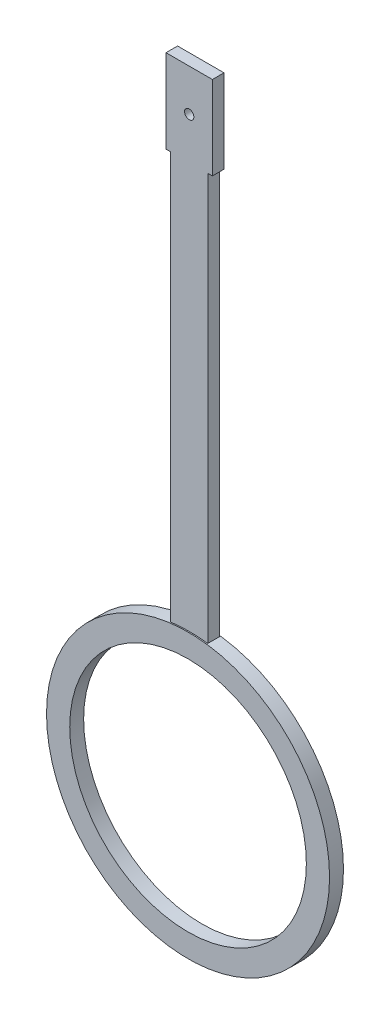
ISO-10303-21;
HEADER;
FILE_DESCRIPTION(('STEP AP214'),'2;1');
FILE_NAME('part.step','',(''),(''),'','','');
FILE_SCHEMA(('AUTOMOTIVE_DESIGN { 1 0 10303 214 1 1 1 1 }'));
ENDSEC;
DATA;
#1=APPLICATION_CONTEXT('core data for automotive mechanical design processes');
#2=APPLICATION_PROTOCOL_DEFINITION('international standard','automotive_design',2000,#1);
#3=PRODUCT_CONTEXT('',#1,'mechanical');
#4=PRODUCT('Part','Part','',(#3));
#5=PRODUCT_RELATED_PRODUCT_CATEGORY('part','',(#4));
#6=PRODUCT_DEFINITION_FORMATION('','',#4);
#7=PRODUCT_DEFINITION_CONTEXT('part definition',#1,'design');
#8=PRODUCT_DEFINITION('design','',#6,#7);
#9=PRODUCT_DEFINITION_SHAPE('','',#8);
#10=(LENGTH_UNIT() NAMED_UNIT(*) SI_UNIT(.MILLI.,.METRE.));
#11=(NAMED_UNIT(*) PLANE_ANGLE_UNIT() SI_UNIT($,.RADIAN.));
#12=(NAMED_UNIT(*) SI_UNIT($,.STERADIAN.) SOLID_ANGLE_UNIT());
#13=UNCERTAINTY_MEASURE_WITH_UNIT(LENGTH_MEASURE(1.E-05),#10,'distance_accuracy_value','');
#14=(GEOMETRIC_REPRESENTATION_CONTEXT(3) GLOBAL_UNCERTAINTY_ASSIGNED_CONTEXT((#13)) GLOBAL_UNIT_ASSIGNED_CONTEXT((#10,
#11,#12)) REPRESENTATION_CONTEXT('',''));
#15=CARTESIAN_POINT('',(0.,0.,0.));
#16=DIRECTION('',(0.,0.,1.));
#17=DIRECTION('',(1.,0.,0.));
#18=AXIS2_PLACEMENT_3D('',#15,#16,#17);
#19=CARTESIAN_POINT('',(0.,0.,1.5));
#20=DIRECTION('',(0.,0.,-1.));
#21=DIRECTION('',(-1.,0.,0.));
#22=AXIS2_PLACEMENT_3D('',#19,#20,#21);
#23=CYLINDRICAL_SURFACE('',#22,30.5);
#24=DIRECTION('',(0.,0.,-1.));
#25=VECTOR('',#24,1.);
#26=CARTESIAN_POINT('',(4.,30.2365672654817,1.5));
#27=LINE('',#26,#25);
#28=CARTESIAN_POINT('',(4.,30.2365672654817,1.25));
#29=VERTEX_POINT('',#28);
#30=CARTESIAN_POINT('',(4.,30.2365672654817,-1.25));
#31=VERTEX_POINT('',#30);
#32=EDGE_CURVE('E58',#29,#31,#27,.T.);
#33=ORIENTED_EDGE('',*,*,#32,.F.);
#34=CARTESIAN_POINT('',(0.,0.,1.25));
#35=DIRECTION('',(0.,0.,1.));
#36=DIRECTION('',(1.,0.,0.));
#37=AXIS2_PLACEMENT_3D('',#34,#35,#36);
#38=CIRCLE('',#37,30.5);
#39=CARTESIAN_POINT('',(-4.,30.2365672654817,1.25));
#40=VERTEX_POINT('',#39);
#41=EDGE_CURVE('E11',#29,#40,#38,.T.);
#42=ORIENTED_EDGE('',*,*,#41,.T.);
#43=DIRECTION('',(0.,0.,-1.));
#44=VECTOR('',#43,1.);
#45=CARTESIAN_POINT('',(-4.,30.2365672654817,1.5));
#46=LINE('',#45,#44);
#47=CARTESIAN_POINT('',(-4.,30.2365672654817,-1.25));
#48=VERTEX_POINT('',#47);
#49=EDGE_CURVE('E47',#48,#40,#46,.F.);
#50=ORIENTED_EDGE('',*,*,#49,.F.);
#51=CARTESIAN_POINT('',(0.,0.,-1.25));
#52=DIRECTION('',(0.,0.,1.));
#53=DIRECTION('',(1.,0.,0.));
#54=AXIS2_PLACEMENT_3D('',#51,#52,#53);
#55=CIRCLE('',#54,30.5);
#56=EDGE_CURVE('E152',#31,#48,#55,.T.);
#57=ORIENTED_EDGE('',*,*,#56,.F.);
#58=EDGE_LOOP('',(#33,#42,#50,#57));
#59=FACE_BOUND('',#58,.T.);
#60=CARTESIAN_POINT('',(0.,0.,1.5));
#61=DIRECTION('',(0.,0.,1.));
#62=DIRECTION('',(1.,0.,0.));
#63=AXIS2_PLACEMENT_3D('',#60,#61,#62);
#64=CIRCLE('',#63,30.5);
#65=CARTESIAN_POINT('',(30.5,0.,1.5));
#66=VERTEX_POINT('',#65);
#67=EDGE_CURVE('E151',#66,#66,#64,.T.);
#68=ORIENTED_EDGE('',*,*,#67,.F.);
#69=EDGE_LOOP('',(#68));
#70=FACE_BOUND('',#69,.T.);
#71=CARTESIAN_POINT('',(0.,0.,-1.5));
#72=DIRECTION('',(0.,0.,1.));
#73=DIRECTION('',(1.,0.,0.));
#74=AXIS2_PLACEMENT_3D('',#71,#72,#73);
#75=CIRCLE('',#74,30.5);
#76=CARTESIAN_POINT('',(30.5,0.,-1.5));
#77=VERTEX_POINT('',#76);
#78=EDGE_CURVE('E147',#77,#77,#75,.T.);
#79=ORIENTED_EDGE('',*,*,#78,.T.);
#80=EDGE_LOOP('',(#79));
#81=FACE_BOUND('',#80,.T.);
#82=ADVANCED_FACE('F41',(#59,#70,#81),#23,.T.);
#83=CARTESIAN_POINT('',(0.,0.,1.5));
#84=DIRECTION('',(0.,0.,1.));
#85=DIRECTION('',(1.,0.,0.));
#86=AXIS2_PLACEMENT_3D('',#83,#84,#85);
#87=PLANE('',#86);
#88=CARTESIAN_POINT('',(0.,0.,1.5));
#89=DIRECTION('',(0.,0.,1.));
#90=DIRECTION('',(1.,0.,0.));
#91=AXIS2_PLACEMENT_3D('',#88,#89,#90);
#92=CIRCLE('',#91,25.5);
#93=CARTESIAN_POINT('',(25.5,0.,1.5));
#94=VERTEX_POINT('',#93);
#95=EDGE_CURVE('E165',#94,#94,#92,.T.);
#96=ORIENTED_EDGE('',*,*,#95,.F.);
#97=EDGE_LOOP('',(#96));
#98=FACE_BOUND('',#97,.T.);
#99=ORIENTED_EDGE('',*,*,#67,.T.);
#100=EDGE_LOOP('',(#99));
#101=FACE_BOUND('',#100,.T.);
#102=ADVANCED_FACE('F217',(#98,#101),#87,.T.);
#103=CARTESIAN_POINT('',(0.,0.,-1.5));
#104=DIRECTION('',(0.,0.,1.));
#105=DIRECTION('',(1.,0.,0.));
#106=AXIS2_PLACEMENT_3D('',#103,#104,#105);
#107=PLANE('',#106);
#108=CARTESIAN_POINT('',(0.,0.,-1.5));
#109=DIRECTION('',(0.,0.,1.));
#110=DIRECTION('',(1.,0.,0.));
#111=AXIS2_PLACEMENT_3D('',#108,#109,#110);
#112=CIRCLE('',#111,25.5);
#113=CARTESIAN_POINT('',(25.5,0.,-1.5));
#114=VERTEX_POINT('',#113);
#115=EDGE_CURVE('E159',#114,#114,#112,.T.);
#116=ORIENTED_EDGE('',*,*,#115,.T.);
#117=EDGE_LOOP('',(#116));
#118=FACE_BOUND('',#117,.T.);
#119=ORIENTED_EDGE('',*,*,#78,.F.);
#120=EDGE_LOOP('',(#119));
#121=FACE_BOUND('',#120,.T.);
#122=ADVANCED_FACE('F224',(#118,#121),#107,.F.);
#123=CARTESIAN_POINT('',(-4.,118.,1.25));
#124=DIRECTION('',(1.,0.,0.));
#125=DIRECTION('',(0.,0.,-1.));
#126=AXIS2_PLACEMENT_3D('',#123,#124,#125);
#127=PLANE('',#126);
#128=DIRECTION('',(0.,-1.,0.));
#129=VECTOR('',#128,1.);
#130=CARTESIAN_POINT('',(-4.,118.,-1.25));
#131=LINE('',#130,#129);
#132=CARTESIAN_POINT('',(-4.,118.,-1.25));
#133=VERTEX_POINT('',#132);
#134=EDGE_CURVE('E128',#133,#48,#131,.T.);
#135=ORIENTED_EDGE('',*,*,#134,.T.);
#136=ORIENTED_EDGE('',*,*,#49,.T.);
#137=DIRECTION('',(0.,-1.,0.));
#138=VECTOR('',#137,1.);
#139=CARTESIAN_POINT('',(-4.,118.,1.25));
#140=LINE('',#139,#138);
#141=CARTESIAN_POINT('',(-4.,118.,1.25));
#142=VERTEX_POINT('',#141);
#143=EDGE_CURVE('E143',#142,#40,#140,.T.);
#144=ORIENTED_EDGE('',*,*,#143,.F.);
#145=DIRECTION('',(0.,0.,-1.));
#146=VECTOR('',#145,1.);
#147=CARTESIAN_POINT('',(-4.,118.,1.25));
#148=LINE('',#147,#146);
#149=EDGE_CURVE('E112',#142,#133,#148,.T.);
#150=ORIENTED_EDGE('',*,*,#149,.T.);
#151=EDGE_LOOP('',(#135,#136,#144,#150));
#152=FACE_BOUND('',#151,.T.);
#153=ADVANCED_FACE('F196',(#152),#127,.F.);
#154=CARTESIAN_POINT('',(4.,25.,1.25));
#155=DIRECTION('',(-1.,0.,0.));
#156=DIRECTION('',(0.,0.,1.));
#157=AXIS2_PLACEMENT_3D('',#154,#155,#156);
#158=PLANE('',#157);
#159=DIRECTION('',(0.,1.,0.));
#160=VECTOR('',#159,1.);
#161=CARTESIAN_POINT('',(4.,25.,1.25));
#162=LINE('',#161,#160);
#163=CARTESIAN_POINT('',(4.,118.,1.25));
#164=VERTEX_POINT('',#163);
#165=EDGE_CURVE('E141',#29,#164,#162,.T.);
#166=ORIENTED_EDGE('',*,*,#165,.F.);
#167=ORIENTED_EDGE('',*,*,#32,.T.);
#168=DIRECTION('',(0.,1.,0.));
#169=VECTOR('',#168,1.);
#170=CARTESIAN_POINT('',(4.,25.,-1.25));
#171=LINE('',#170,#169);
#172=CARTESIAN_POINT('',(4.,118.,-1.25));
#173=VERTEX_POINT('',#172);
#174=EDGE_CURVE('E133',#31,#173,#171,.T.);
#175=ORIENTED_EDGE('',*,*,#174,.T.);
#176=DIRECTION('',(0.,0.,-1.));
#177=VECTOR('',#176,1.);
#178=CARTESIAN_POINT('',(4.,118.,1.25));
#179=LINE('',#178,#177);
#180=EDGE_CURVE('E150',#164,#173,#179,.T.);
#181=ORIENTED_EDGE('',*,*,#180,.F.);
#182=EDGE_LOOP('',(#166,#167,#175,#181));
#183=FACE_BOUND('',#182,.T.);
#184=ADVANCED_FACE('F205',(#183),#158,.F.);
#185=CARTESIAN_POINT('',(0.,0.,1.25));
#186=DIRECTION('',(0.,0.,1.));
#187=DIRECTION('',(1.,0.,0.));
#188=AXIS2_PLACEMENT_3D('',#185,#186,#187);
#189=PLANE('',#188);
#190=CARTESIAN_POINT('',(0.,127.,1.25));
#191=DIRECTION('',(0.,0.,1.));
#192=DIRECTION('',(1.,0.,0.));
#193=AXIS2_PLACEMENT_3D('',#190,#191,#192);
#194=CIRCLE('',#193,1.);
#195=CARTESIAN_POINT('',(1.,127.,1.25));
#196=VERTEX_POINT('',#195);
#197=EDGE_CURVE('E162',#196,#196,#194,.T.);
#198=ORIENTED_EDGE('',*,*,#197,.F.);
#199=EDGE_LOOP('',(#198));
#200=FACE_BOUND('',#199,.T.);
#201=ORIENTED_EDGE('',*,*,#41,.F.);
#202=ORIENTED_EDGE('',*,*,#165,.T.);
#203=DIRECTION('',(1.,0.,0.));
#204=VECTOR('',#203,1.);
#205=CARTESIAN_POINT('',(-5.,118.,1.25));
#206=LINE('',#205,#204);
#207=CARTESIAN_POINT('',(5.,118.,1.25));
#208=VERTEX_POINT('',#207);
#209=EDGE_CURVE('E113',#164,#208,#206,.T.);
#210=ORIENTED_EDGE('',*,*,#209,.T.);
#211=DIRECTION('',(0.,1.,0.));
#212=VECTOR('',#211,1.);
#213=CARTESIAN_POINT('',(5.,118.,1.25));
#214=LINE('',#213,#212);
#215=CARTESIAN_POINT('',(5.,136.,1.25));
#216=VERTEX_POINT('',#215);
#217=EDGE_CURVE('E111',#208,#216,#214,.T.);
#218=ORIENTED_EDGE('',*,*,#217,.T.);
#219=DIRECTION('',(-1.,0.,0.));
#220=VECTOR('',#219,1.);
#221=CARTESIAN_POINT('',(5.,136.,1.25));
#222=LINE('',#221,#220);
#223=CARTESIAN_POINT('',(-5.,136.,1.25));
#224=VERTEX_POINT('',#223);
#225=EDGE_CURVE('E121',#216,#224,#222,.T.);
#226=ORIENTED_EDGE('',*,*,#225,.T.);
#227=DIRECTION('',(0.,-1.,0.));
#228=VECTOR('',#227,1.);
#229=CARTESIAN_POINT('',(-5.,136.,1.25));
#230=LINE('',#229,#228);
#231=CARTESIAN_POINT('',(-5.,118.,1.25));
#232=VERTEX_POINT('',#231);
#233=EDGE_CURVE('E119',#224,#232,#230,.T.);
#234=ORIENTED_EDGE('',*,*,#233,.T.);
#235=EDGE_CURVE('E102',#232,#142,#206,.T.);
#236=ORIENTED_EDGE('',*,*,#235,.T.);
#237=ORIENTED_EDGE('',*,*,#143,.T.);
#238=EDGE_LOOP('',(#201,#202,#210,#218,#226,#234,#236,#237));
#239=FACE_BOUND('',#238,.T.);
#240=ADVANCED_FACE('F118',(#200,#239),#189,.T.);
#241=CARTESIAN_POINT('',(0.,0.,-1.25));
#242=DIRECTION('',(0.,0.,1.));
#243=DIRECTION('',(1.,0.,0.));
#244=AXIS2_PLACEMENT_3D('',#241,#242,#243);
#245=PLANE('',#244);
#246=CARTESIAN_POINT('',(0.,127.,-1.25));
#247=DIRECTION('',(0.,0.,1.));
#248=DIRECTION('',(1.,0.,0.));
#249=AXIS2_PLACEMENT_3D('',#246,#247,#248);
#250=CIRCLE('',#249,1.);
#251=CARTESIAN_POINT('',(1.,127.,-1.25));
#252=VERTEX_POINT('',#251);
#253=EDGE_CURVE('E42',#252,#252,#250,.T.);
#254=ORIENTED_EDGE('',*,*,#253,.T.);
#255=EDGE_LOOP('',(#254));
#256=FACE_BOUND('',#255,.T.);
#257=ORIENTED_EDGE('',*,*,#174,.F.);
#258=ORIENTED_EDGE('',*,*,#56,.T.);
#259=ORIENTED_EDGE('',*,*,#134,.F.);
#260=DIRECTION('',(1.,0.,0.));
#261=VECTOR('',#260,1.);
#262=CARTESIAN_POINT('',(-5.,118.,-1.25));
#263=LINE('',#262,#261);
#264=CARTESIAN_POINT('',(-5.,118.,-1.25));
#265=VERTEX_POINT('',#264);
#266=EDGE_CURVE('E178',#265,#133,#263,.T.);
#267=ORIENTED_EDGE('',*,*,#266,.F.);
#268=DIRECTION('',(0.,-1.,0.));
#269=VECTOR('',#268,1.);
#270=CARTESIAN_POINT('',(-5.,136.,-1.25));
#271=LINE('',#270,#269);
#272=CARTESIAN_POINT('',(-5.,136.,-1.25));
#273=VERTEX_POINT('',#272);
#274=EDGE_CURVE('E129',#273,#265,#271,.T.);
#275=ORIENTED_EDGE('',*,*,#274,.F.);
#276=DIRECTION('',(-1.,0.,0.));
#277=VECTOR('',#276,1.);
#278=CARTESIAN_POINT('',(5.,136.,-1.25));
#279=LINE('',#278,#277);
#280=CARTESIAN_POINT('',(5.,136.,-1.25));
#281=VERTEX_POINT('',#280);
#282=EDGE_CURVE('E124',#281,#273,#279,.T.);
#283=ORIENTED_EDGE('',*,*,#282,.F.);
#284=DIRECTION('',(0.,1.,0.));
#285=VECTOR('',#284,1.);
#286=CARTESIAN_POINT('',(5.,118.,-1.25));
#287=LINE('',#286,#285);
#288=CARTESIAN_POINT('',(5.,118.,-1.25));
#289=VERTEX_POINT('',#288);
#290=EDGE_CURVE('E182',#289,#281,#287,.T.);
#291=ORIENTED_EDGE('',*,*,#290,.F.);
#292=EDGE_CURVE('E177',#173,#289,#263,.T.);
#293=ORIENTED_EDGE('',*,*,#292,.F.);
#294=EDGE_LOOP('',(#257,#258,#259,#267,#275,#283,#291,#293));
#295=FACE_BOUND('',#294,.T.);
#296=ADVANCED_FACE('F193',(#256,#295),#245,.F.);
#297=CARTESIAN_POINT('',(-5.,118.,1.25));
#298=DIRECTION('',(0.,1.,0.));
#299=DIRECTION('',(0.,0.,1.));
#300=AXIS2_PLACEMENT_3D('',#297,#298,#299);
#301=PLANE('',#300);
#302=ORIENTED_EDGE('',*,*,#209,.F.);
#303=ORIENTED_EDGE('',*,*,#180,.T.);
#304=ORIENTED_EDGE('',*,*,#292,.T.);
#305=DIRECTION('',(0.,0.,-1.));
#306=VECTOR('',#305,1.);
#307=CARTESIAN_POINT('',(5.,118.,1.25));
#308=LINE('',#307,#306);
#309=EDGE_CURVE('E131',#208,#289,#308,.T.);
#310=ORIENTED_EDGE('',*,*,#309,.F.);
#311=EDGE_LOOP('',(#302,#303,#304,#310));
#312=FACE_BOUND('',#311,.T.);
#313=ADVANCED_FACE('F206',(#312),#301,.F.);
#314=CARTESIAN_POINT('',(-5.,136.,1.25));
#315=DIRECTION('',(1.,0.,0.));
#316=DIRECTION('',(0.,0.,-1.));
#317=AXIS2_PLACEMENT_3D('',#314,#315,#316);
#318=PLANE('',#317);
#319=ORIENTED_EDGE('',*,*,#274,.T.);
#320=DIRECTION('',(0.,0.,-1.));
#321=VECTOR('',#320,1.);
#322=CARTESIAN_POINT('',(-5.,118.,1.25));
#323=LINE('',#322,#321);
#324=EDGE_CURVE('E108',#232,#265,#323,.T.);
#325=ORIENTED_EDGE('',*,*,#324,.F.);
#326=ORIENTED_EDGE('',*,*,#233,.F.);
#327=DIRECTION('',(0.,0.,-1.));
#328=VECTOR('',#327,1.);
#329=CARTESIAN_POINT('',(-5.,136.,1.25));
#330=LINE('',#329,#328);
#331=EDGE_CURVE('E176',#224,#273,#330,.T.);
#332=ORIENTED_EDGE('',*,*,#331,.T.);
#333=EDGE_LOOP('',(#319,#325,#326,#332));
#334=FACE_BOUND('',#333,.T.);
#335=ADVANCED_FACE('F130',(#334),#318,.F.);
#336=ORIENTED_EDGE('',*,*,#149,.F.);
#337=ORIENTED_EDGE('',*,*,#235,.F.);
#338=ORIENTED_EDGE('',*,*,#324,.T.);
#339=ORIENTED_EDGE('',*,*,#266,.T.);
#340=EDGE_LOOP('',(#336,#337,#338,#339));
#341=FACE_BOUND('',#340,.T.);
#342=ADVANCED_FACE('F106',(#341),#301,.F.);
#343=CARTESIAN_POINT('',(5.,118.,1.25));
#344=DIRECTION('',(-1.,0.,0.));
#345=DIRECTION('',(0.,0.,1.));
#346=AXIS2_PLACEMENT_3D('',#343,#344,#345);
#347=PLANE('',#346);
#348=ORIENTED_EDGE('',*,*,#290,.T.);
#349=DIRECTION('',(0.,0.,-1.));
#350=VECTOR('',#349,1.);
#351=CARTESIAN_POINT('',(5.,136.,1.25));
#352=LINE('',#351,#350);
#353=EDGE_CURVE('E140',#216,#281,#352,.T.);
#354=ORIENTED_EDGE('',*,*,#353,.F.);
#355=ORIENTED_EDGE('',*,*,#217,.F.);
#356=ORIENTED_EDGE('',*,*,#309,.T.);
#357=EDGE_LOOP('',(#348,#354,#355,#356));
#358=FACE_BOUND('',#357,.T.);
#359=ADVANCED_FACE('F210',(#358),#347,.F.);
#360=CARTESIAN_POINT('',(5.,136.,1.25));
#361=DIRECTION('',(0.,-1.,0.));
#362=DIRECTION('',(0.,0.,-1.));
#363=AXIS2_PLACEMENT_3D('',#360,#361,#362);
#364=PLANE('',#363);
#365=ORIENTED_EDGE('',*,*,#282,.T.);
#366=ORIENTED_EDGE('',*,*,#331,.F.);
#367=ORIENTED_EDGE('',*,*,#225,.F.);
#368=ORIENTED_EDGE('',*,*,#353,.T.);
#369=EDGE_LOOP('',(#365,#366,#367,#368));
#370=FACE_BOUND('',#369,.T.);
#371=ADVANCED_FACE('F189',(#370),#364,.F.);
#372=CARTESIAN_POINT('',(0.,0.,-10.));
#373=DIRECTION('',(0.,0.,1.));
#374=DIRECTION('',(1.,0.,0.));
#375=AXIS2_PLACEMENT_3D('',#372,#373,#374);
#376=CYLINDRICAL_SURFACE('',#375,25.5);
#377=ORIENTED_EDGE('',*,*,#95,.T.);
#378=EDGE_LOOP('',(#377));
#379=FACE_BOUND('',#378,.T.);
#380=ORIENTED_EDGE('',*,*,#115,.F.);
#381=EDGE_LOOP('',(#380));
#382=FACE_BOUND('',#381,.T.);
#383=ADVANCED_FACE('F212',(#379,#382),#376,.F.);
#384=CARTESIAN_POINT('',(0.,127.,-10.));
#385=DIRECTION('',(0.,0.,1.));
#386=DIRECTION('',(1.,0.,0.));
#387=AXIS2_PLACEMENT_3D('',#384,#385,#386);
#388=CYLINDRICAL_SURFACE('',#387,1.);
#389=ORIENTED_EDGE('',*,*,#197,.T.);
#390=EDGE_LOOP('',(#389));
#391=FACE_BOUND('',#390,.T.);
#392=ORIENTED_EDGE('',*,*,#253,.F.);
#393=EDGE_LOOP('',(#392));
#394=FACE_BOUND('',#393,.T.);
#395=ADVANCED_FACE('F296',(#391,#394),#388,.F.);
#396=CLOSED_SHELL('',(#82,#102,#122,#153,#184,#240,#296,#313,#335,#342,#359,#371,#383,#395));
#397=MANIFOLD_SOLID_BREP('B2',#396);
#398=ADVANCED_BREP_SHAPE_REPRESENTATION('',(#18,#397),#14);
#399=SHAPE_DEFINITION_REPRESENTATION(#9,#398);
ENDSEC;
END-ISO-10303-21;
